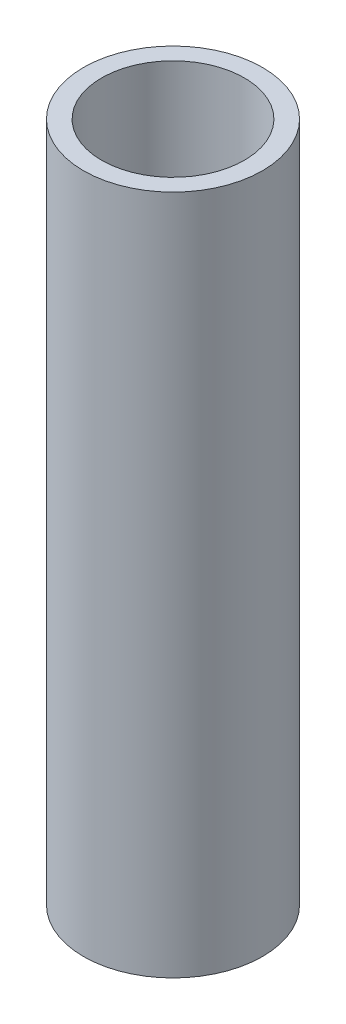
ISO-10303-21;
HEADER;
FILE_DESCRIPTION(('STEP AP214'),'2;1');
FILE_NAME('part.step','',(''),(''),'','','');
FILE_SCHEMA(('AUTOMOTIVE_DESIGN { 1 0 10303 214 1 1 1 1 }'));
ENDSEC;
DATA;
#1=APPLICATION_CONTEXT('core data for automotive mechanical design processes');
#2=APPLICATION_PROTOCOL_DEFINITION('international standard','automotive_design',2000,#1);
#3=PRODUCT_CONTEXT('',#1,'mechanical');
#4=PRODUCT('Part','Part','',(#3));
#5=PRODUCT_RELATED_PRODUCT_CATEGORY('part','',(#4));
#6=PRODUCT_DEFINITION_FORMATION('','',#4);
#7=PRODUCT_DEFINITION_CONTEXT('part definition',#1,'design');
#8=PRODUCT_DEFINITION('design','',#6,#7);
#9=PRODUCT_DEFINITION_SHAPE('','',#8);
#10=(LENGTH_UNIT() NAMED_UNIT(*) SI_UNIT(.MILLI.,.METRE.));
#11=(NAMED_UNIT(*) PLANE_ANGLE_UNIT() SI_UNIT($,.RADIAN.));
#12=(NAMED_UNIT(*) SI_UNIT($,.STERADIAN.) SOLID_ANGLE_UNIT());
#13=UNCERTAINTY_MEASURE_WITH_UNIT(LENGTH_MEASURE(1.E-05),#10,'distance_accuracy_value','');
#14=(GEOMETRIC_REPRESENTATION_CONTEXT(3) GLOBAL_UNCERTAINTY_ASSIGNED_CONTEXT((#13)) GLOBAL_UNIT_ASSIGNED_CONTEXT((#10,
#11,#12)) REPRESENTATION_CONTEXT('',''));
#15=CARTESIAN_POINT('',(0.,0.,0.));
#16=DIRECTION('',(0.,0.,1.));
#17=DIRECTION('',(1.,0.,0.));
#18=AXIS2_PLACEMENT_3D('',#15,#16,#17);
#19=CARTESIAN_POINT('',(0.,127.,0.));
#20=DIRECTION('',(0.,1.,0.));
#21=DIRECTION('',(0.,0.,1.));
#22=AXIS2_PLACEMENT_3D('',#19,#20,#21);
#23=PLANE('',#22);
#24=CARTESIAN_POINT('',(0.,127.,0.));
#25=DIRECTION('',(0.,1.,0.));
#26=DIRECTION('',(0.,0.,1.));
#27=AXIS2_PLACEMENT_3D('',#24,#25,#26);
#28=CIRCLE('',#27,16.7005);
#29=CARTESIAN_POINT('',(0.,127.,16.7005));
#30=VERTEX_POINT('',#29);
#31=EDGE_CURVE('E10',#30,#30,#28,.T.);
#32=ORIENTED_EDGE('',*,*,#31,.T.);
#33=EDGE_LOOP('',(#32));
#34=FACE_BOUND('',#33,.T.);
#35=CARTESIAN_POINT('',(0.,127.,0.));
#36=DIRECTION('',(0.,1.,0.));
#37=DIRECTION('',(0.,0.,1.));
#38=AXIS2_PLACEMENT_3D('',#35,#36,#37);
#39=CIRCLE('',#38,13.3223);
#40=CARTESIAN_POINT('',(0.,127.,13.3223));
#41=VERTEX_POINT('',#40);
#42=EDGE_CURVE('E42',#41,#41,#39,.T.);
#43=ORIENTED_EDGE('',*,*,#42,.F.);
#44=EDGE_LOOP('',(#43));
#45=FACE_BOUND('',#44,.T.);
#46=ADVANCED_FACE('F31',(#34,#45),#23,.T.);
#47=CARTESIAN_POINT('',(0.,0.,0.));
#48=DIRECTION('',(0.,1.,0.));
#49=DIRECTION('',(0.,0.,1.));
#50=AXIS2_PLACEMENT_3D('',#47,#48,#49);
#51=PLANE('',#50);
#52=CARTESIAN_POINT('',(0.,0.,0.));
#53=DIRECTION('',(0.,1.,0.));
#54=DIRECTION('',(0.,0.,1.));
#55=AXIS2_PLACEMENT_3D('',#52,#53,#54);
#56=CIRCLE('',#55,16.7005);
#57=CARTESIAN_POINT('',(0.,0.,16.7005));
#58=VERTEX_POINT('',#57);
#59=EDGE_CURVE('E35',#58,#58,#56,.T.);
#60=ORIENTED_EDGE('',*,*,#59,.F.);
#61=EDGE_LOOP('',(#60));
#62=FACE_BOUND('',#61,.T.);
#63=CARTESIAN_POINT('',(0.,0.,0.));
#64=DIRECTION('',(0.,1.,0.));
#65=DIRECTION('',(0.,0.,1.));
#66=AXIS2_PLACEMENT_3D('',#63,#64,#65);
#67=CIRCLE('',#66,13.3223);
#68=CARTESIAN_POINT('',(0.,0.,13.3223));
#69=VERTEX_POINT('',#68);
#70=EDGE_CURVE('E44',#69,#69,#67,.T.);
#71=ORIENTED_EDGE('',*,*,#70,.T.);
#72=EDGE_LOOP('',(#71));
#73=FACE_BOUND('',#72,.T.);
#74=ADVANCED_FACE('F54',(#62,#73),#51,.F.);
#75=CARTESIAN_POINT('',(0.,127.,0.));
#76=DIRECTION('',(0.,-1.,0.));
#77=DIRECTION('',(0.,0.,-1.));
#78=AXIS2_PLACEMENT_3D('',#75,#76,#77);
#79=CYLINDRICAL_SURFACE('',#78,16.7005);
#80=ORIENTED_EDGE('',*,*,#31,.F.);
#81=EDGE_LOOP('',(#80));
#82=FACE_BOUND('',#81,.T.);
#83=ORIENTED_EDGE('',*,*,#59,.T.);
#84=EDGE_LOOP('',(#83));
#85=FACE_BOUND('',#84,.T.);
#86=ADVANCED_FACE('F33',(#82,#85),#79,.T.);
#87=CARTESIAN_POINT('',(0.,127.,0.));
#88=DIRECTION('',(0.,-1.,0.));
#89=DIRECTION('',(0.,0.,-1.));
#90=AXIS2_PLACEMENT_3D('',#87,#88,#89);
#91=CYLINDRICAL_SURFACE('',#90,13.3223);
#92=ORIENTED_EDGE('',*,*,#42,.T.);
#93=EDGE_LOOP('',(#92));
#94=FACE_BOUND('',#93,.T.);
#95=ORIENTED_EDGE('',*,*,#70,.F.);
#96=EDGE_LOOP('',(#95));
#97=FACE_BOUND('',#96,.T.);
#98=ADVANCED_FACE('F50',(#94,#97),#91,.F.);
#99=CLOSED_SHELL('',(#46,#74,#86,#98));
#100=MANIFOLD_SOLID_BREP('B2',#99);
#101=ADVANCED_BREP_SHAPE_REPRESENTATION('',(#18,#100),#14);
#102=SHAPE_DEFINITION_REPRESENTATION(#9,#101);
ENDSEC;
END-ISO-10303-21;
